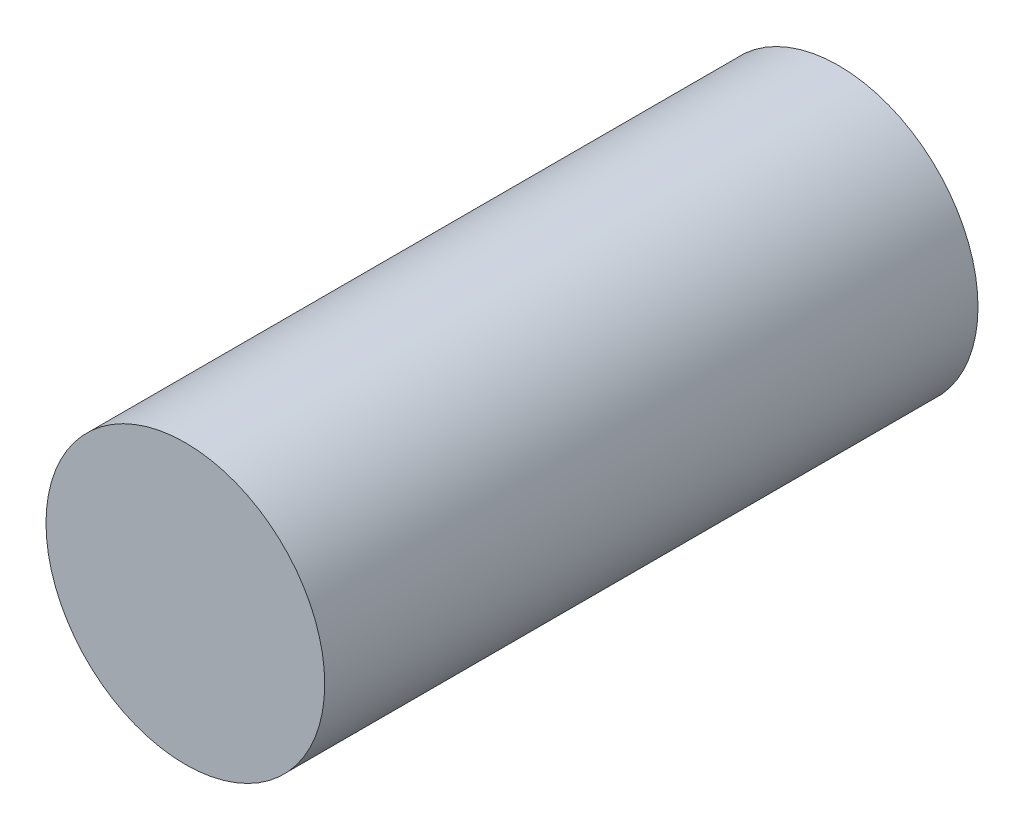
ISO-10303-21;
HEADER;
FILE_DESCRIPTION(('STEP AP214'),'2;1');
FILE_NAME('part.step','',(''),(''),'','','');
FILE_SCHEMA(('AUTOMOTIVE_DESIGN { 1 0 10303 214 1 1 1 1 }'));
ENDSEC;
DATA;
#1=APPLICATION_CONTEXT('core data for automotive mechanical design processes');
#2=APPLICATION_PROTOCOL_DEFINITION('international standard','automotive_design',2000,#1);
#3=PRODUCT_CONTEXT('',#1,'mechanical');
#4=PRODUCT('Part','Part','',(#3));
#5=PRODUCT_RELATED_PRODUCT_CATEGORY('part','',(#4));
#6=PRODUCT_DEFINITION_FORMATION('','',#4);
#7=PRODUCT_DEFINITION_CONTEXT('part definition',#1,'design');
#8=PRODUCT_DEFINITION('design','',#6,#7);
#9=PRODUCT_DEFINITION_SHAPE('','',#8);
#10=(LENGTH_UNIT() NAMED_UNIT(*) SI_UNIT(.MILLI.,.METRE.));
#11=(NAMED_UNIT(*) PLANE_ANGLE_UNIT() SI_UNIT($,.RADIAN.));
#12=(NAMED_UNIT(*) SI_UNIT($,.STERADIAN.) SOLID_ANGLE_UNIT());
#13=UNCERTAINTY_MEASURE_WITH_UNIT(LENGTH_MEASURE(1.E-05),#10,'distance_accuracy_value','');
#14=(GEOMETRIC_REPRESENTATION_CONTEXT(3) GLOBAL_UNCERTAINTY_ASSIGNED_CONTEXT((#13)) GLOBAL_UNIT_ASSIGNED_CONTEXT((#10,
#11,#12)) REPRESENTATION_CONTEXT('',''));
#15=CARTESIAN_POINT('',(0.,0.,0.));
#16=DIRECTION('',(0.,0.,1.));
#17=DIRECTION('',(1.,0.,0.));
#18=AXIS2_PLACEMENT_3D('',#15,#16,#17);
#19=CARTESIAN_POINT('',(0.,0.,300.));
#20=DIRECTION('',(0.,0.,-1.));
#21=DIRECTION('',(-1.,0.,0.));
#22=AXIS2_PLACEMENT_3D('',#19,#20,#21);
#23=CYLINDRICAL_SURFACE('',#22,64.);
#24=CARTESIAN_POINT('',(0.,0.,300.));
#25=DIRECTION('',(0.,0.,1.));
#26=DIRECTION('',(1.,0.,0.));
#27=AXIS2_PLACEMENT_3D('',#24,#25,#26);
#28=CIRCLE('',#27,64.);
#29=CARTESIAN_POINT('',(64.,0.,300.));
#30=VERTEX_POINT('',#29);
#31=EDGE_CURVE('E10',#30,#30,#28,.T.);
#32=ORIENTED_EDGE('',*,*,#31,.F.);
#33=EDGE_LOOP('',(#32));
#34=FACE_BOUND('',#33,.T.);
#35=CARTESIAN_POINT('',(0.,0.,0.));
#36=DIRECTION('',(0.,0.,1.));
#37=DIRECTION('',(1.,0.,0.));
#38=AXIS2_PLACEMENT_3D('',#35,#36,#37);
#39=CIRCLE('',#38,64.);
#40=CARTESIAN_POINT('',(64.,0.,0.));
#41=VERTEX_POINT('',#40);
#42=EDGE_CURVE('E35',#41,#41,#39,.T.);
#43=ORIENTED_EDGE('',*,*,#42,.T.);
#44=EDGE_LOOP('',(#43));
#45=FACE_BOUND('',#44,.T.);
#46=ADVANCED_FACE('F32',(#34,#45),#23,.T.);
#47=CARTESIAN_POINT('',(0.,0.,300.));
#48=DIRECTION('',(0.,0.,1.));
#49=DIRECTION('',(1.,0.,0.));
#50=AXIS2_PLACEMENT_3D('',#47,#48,#49);
#51=PLANE('',#50);
#52=ORIENTED_EDGE('',*,*,#31,.T.);
#53=EDGE_LOOP('',(#52));
#54=FACE_BOUND('',#53,.T.);
#55=ADVANCED_FACE('F67',(#54),#51,.T.);
#56=CARTESIAN_POINT('',(0.,0.,0.));
#57=DIRECTION('',(0.,0.,1.));
#58=DIRECTION('',(1.,0.,0.));
#59=AXIS2_PLACEMENT_3D('',#56,#57,#58);
#60=PLANE('',#59);
#61=ORIENTED_EDGE('',*,*,#42,.F.);
#62=EDGE_LOOP('',(#61));
#63=FACE_BOUND('',#62,.T.);
#64=ADVANCED_FACE('F69',(#63),#60,.F.);
#65=CLOSED_SHELL('',(#46,#55,#64));
#66=CARTESIAN_POINT('',(0.,0.,290.));
#67=DIRECTION('',(0.,0.,-1.));
#68=DIRECTION('',(-1.,0.,0.));
#69=AXIS2_PLACEMENT_3D('',#66,#67,#68);
#70=CYLINDRICAL_SURFACE('',#69,60.);
#71=CARTESIAN_POINT('',(0.,0.,290.));
#72=DIRECTION('',(0.,0.,1.));
#73=DIRECTION('',(1.,0.,0.));
#74=AXIS2_PLACEMENT_3D('',#71,#72,#73);
#75=CIRCLE('',#74,60.);
#76=CARTESIAN_POINT('',(60.,0.,290.));
#77=VERTEX_POINT('',#76);
#78=EDGE_CURVE('E42',#77,#77,#75,.T.);
#79=ORIENTED_EDGE('',*,*,#78,.T.);
#80=EDGE_LOOP('',(#79));
#81=FACE_BOUND('',#80,.T.);
#82=CARTESIAN_POINT('',(0.,0.,10.));
#83=DIRECTION('',(0.,0.,1.));
#84=DIRECTION('',(1.,0.,0.));
#85=AXIS2_PLACEMENT_3D('',#82,#83,#84);
#86=CIRCLE('',#85,60.);
#87=CARTESIAN_POINT('',(60.,0.,10.));
#88=VERTEX_POINT('',#87);
#89=EDGE_CURVE('E44',#88,#88,#86,.T.);
#90=ORIENTED_EDGE('',*,*,#89,.F.);
#91=EDGE_LOOP('',(#90));
#92=FACE_BOUND('',#91,.T.);
#93=ADVANCED_FACE('F50',(#81,#92),#70,.F.);
#94=CARTESIAN_POINT('',(0.,0.,290.));
#95=DIRECTION('',(0.,0.,1.));
#96=DIRECTION('',(1.,0.,0.));
#97=AXIS2_PLACEMENT_3D('',#94,#95,#96);
#98=PLANE('',#97);
#99=ORIENTED_EDGE('',*,*,#78,.F.);
#100=EDGE_LOOP('',(#99));
#101=FACE_BOUND('',#100,.T.);
#102=ADVANCED_FACE('F53',(#101),#98,.F.);
#103=CARTESIAN_POINT('',(0.,0.,10.));
#104=DIRECTION('',(0.,0.,1.));
#105=DIRECTION('',(1.,0.,0.));
#106=AXIS2_PLACEMENT_3D('',#103,#104,#105);
#107=PLANE('',#106);
#108=ORIENTED_EDGE('',*,*,#89,.T.);
#109=EDGE_LOOP('',(#108));
#110=FACE_BOUND('',#109,.T.);
#111=ADVANCED_FACE('F55',(#110),#107,.T.);
#112=CLOSED_SHELL('',(#93,#102,#111));
#113=ORIENTED_CLOSED_SHELL('',*,#112,.T.);
#114=BREP_WITH_VOIDS('B2',#65,(#113));
#115=ADVANCED_BREP_SHAPE_REPRESENTATION('',(#18,#114),#14);
#116=SHAPE_DEFINITION_REPRESENTATION(#9,#115);
ENDSEC;
END-ISO-10303-21;
